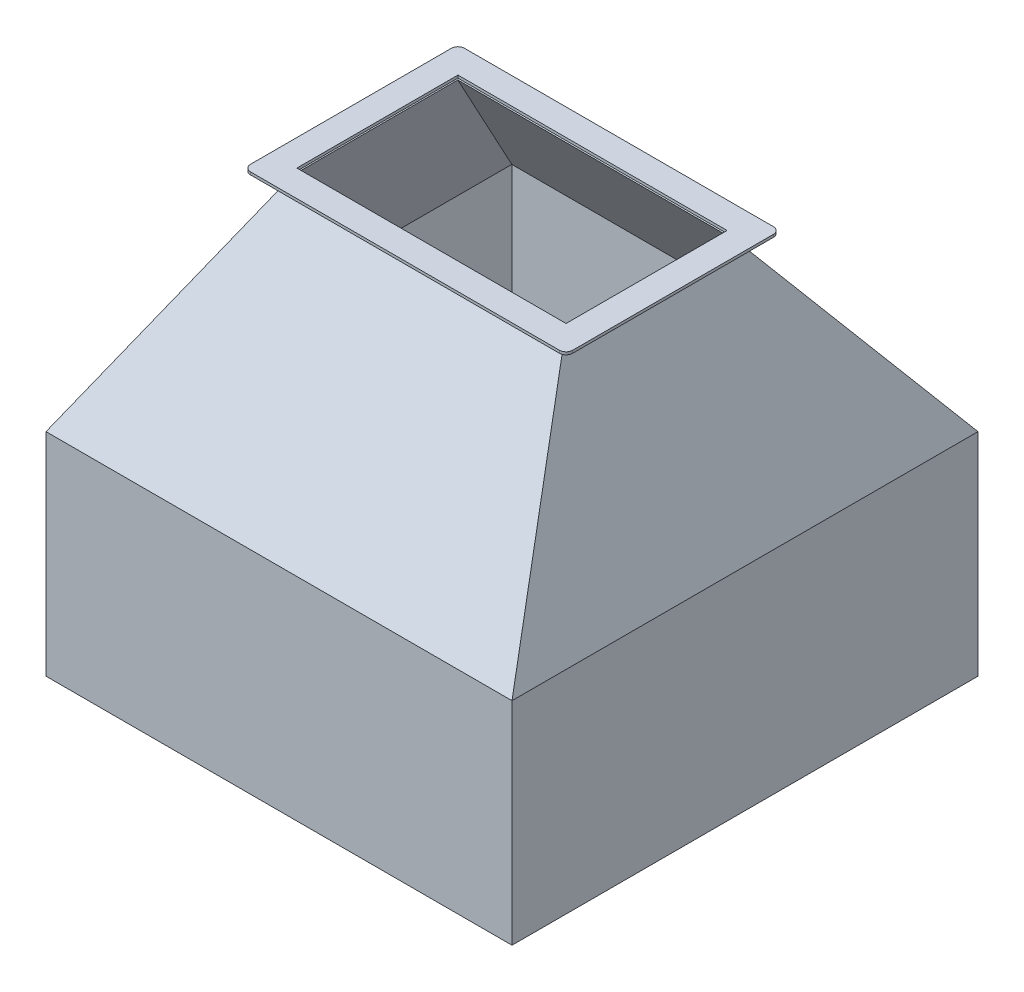
ISO-10303-21;
HEADER;
FILE_DESCRIPTION(('STEP AP214'),'2;1');
FILE_NAME('part.step','',(''),(''),'','','');
FILE_SCHEMA(('AUTOMOTIVE_DESIGN { 1 0 10303 214 1 1 1 1 }'));
ENDSEC;
DATA;
#1=APPLICATION_CONTEXT('core data for automotive mechanical design processes');
#2=APPLICATION_PROTOCOL_DEFINITION('international standard','automotive_design',2000,#1);
#3=PRODUCT_CONTEXT('',#1,'mechanical');
#4=PRODUCT('Part','Part','',(#3));
#5=PRODUCT_RELATED_PRODUCT_CATEGORY('part','',(#4));
#6=PRODUCT_DEFINITION_FORMATION('','',#4);
#7=PRODUCT_DEFINITION_CONTEXT('part definition',#1,'design');
#8=PRODUCT_DEFINITION('design','',#6,#7);
#9=PRODUCT_DEFINITION_SHAPE('','',#8);
#10=(LENGTH_UNIT() NAMED_UNIT(*) SI_UNIT(.MILLI.,.METRE.));
#11=(NAMED_UNIT(*) PLANE_ANGLE_UNIT() SI_UNIT($,.RADIAN.));
#12=(NAMED_UNIT(*) SI_UNIT($,.STERADIAN.) SOLID_ANGLE_UNIT());
#13=UNCERTAINTY_MEASURE_WITH_UNIT(LENGTH_MEASURE(1.E-05),#10,'distance_accuracy_value','');
#14=(GEOMETRIC_REPRESENTATION_CONTEXT(3) GLOBAL_UNCERTAINTY_ASSIGNED_CONTEXT((#13)) GLOBAL_UNIT_ASSIGNED_CONTEXT((#10,
#11,#12)) REPRESENTATION_CONTEXT('',''));
#15=CARTESIAN_POINT('',(0.,0.,0.));
#16=DIRECTION('',(0.,0.,1.));
#17=DIRECTION('',(1.,0.,0.));
#18=AXIS2_PLACEMENT_3D('',#15,#16,#17);
#19=CARTESIAN_POINT('',(0.,-456.,0.));
#20=DIRECTION('',(0.,-1.,0.));
#21=DIRECTION('',(0.,0.,-1.));
#22=AXIS2_PLACEMENT_3D('',#19,#20,#21);
#23=PLANE('',#22);
#24=DIRECTION('',(0.,0.,1.));
#25=VECTOR('',#24,1.);
#26=CARTESIAN_POINT('',(524.651839642762,-456.,0.));
#27=LINE('',#26,#25);
#28=CARTESIAN_POINT('',(524.651839642762,-456.,-524.217759335467));
#29=VERTEX_POINT('',#28);
#30=CARTESIAN_POINT('',(524.651839642762,-456.,524.217759335468));
#31=VERTEX_POINT('',#30);
#32=EDGE_CURVE('E336',#29,#31,#27,.T.);
#33=ORIENTED_EDGE('',*,*,#32,.F.);
#34=DIRECTION('',(1.,0.,0.));
#35=VECTOR('',#34,1.);
#36=CARTESIAN_POINT('',(1.65340518844217E-13,-456.,-524.217759335467));
#37=LINE('',#36,#35);
#38=CARTESIAN_POINT('',(-524.651839642762,-456.,-524.217759335467));
#39=VERTEX_POINT('',#38);
#40=EDGE_CURVE('E338',#39,#29,#37,.T.);
#41=ORIENTED_EDGE('',*,*,#40,.F.);
#42=DIRECTION('',(0.,0.,-1.));
#43=VECTOR('',#42,1.);
#44=CARTESIAN_POINT('',(-524.651839642762,-456.,0.));
#45=LINE('',#44,#43);
#46=CARTESIAN_POINT('',(-524.651839642762,-456.,524.217759335467));
#47=VERTEX_POINT('',#46);
#48=EDGE_CURVE('E340',#47,#39,#45,.T.);
#49=ORIENTED_EDGE('',*,*,#48,.F.);
#50=DIRECTION('',(-1.,0.,0.));
#51=VECTOR('',#50,1.);
#52=CARTESIAN_POINT('',(-1.10227012562812E-13,-456.,524.217759335468));
#53=LINE('',#52,#51);
#54=EDGE_CURVE('E343',#31,#47,#53,.T.);
#55=ORIENTED_EDGE('',*,*,#54,.F.);
#56=EDGE_LOOP('',(#33,#41,#49,#55));
#57=FACE_BOUND('',#56,.T.);
#58=DIRECTION('',(-1.,0.,0.));
#59=VECTOR('',#58,1.);
#60=CARTESIAN_POINT('',(-1.10391493925797E-13,-456.,525.));
#61=LINE('',#60,#59);
#62=CARTESIAN_POINT('',(525.,-456.,525.));
#63=VERTEX_POINT('',#62);
#64=CARTESIAN_POINT('',(-525.,-456.,525.));
#65=VERTEX_POINT('',#64);
#66=EDGE_CURVE('E177',#63,#65,#61,.T.);
#67=ORIENTED_EDGE('',*,*,#66,.T.);
#68=DIRECTION('',(0.,0.,-1.));
#69=VECTOR('',#68,1.);
#70=CARTESIAN_POINT('',(-525.,-456.,0.));
#71=LINE('',#70,#69);
#72=CARTESIAN_POINT('',(-525.,-456.,-525.));
#73=VERTEX_POINT('',#72);
#74=EDGE_CURVE('E190',#65,#73,#71,.T.);
#75=ORIENTED_EDGE('',*,*,#74,.T.);
#76=DIRECTION('',(1.,0.,0.));
#77=VECTOR('',#76,1.);
#78=CARTESIAN_POINT('',(1.65587240888695E-13,-456.,-525.));
#79=LINE('',#78,#77);
#80=CARTESIAN_POINT('',(525.,-456.,-525.));
#81=VERTEX_POINT('',#80);
#82=EDGE_CURVE('E178',#73,#81,#79,.T.);
#83=ORIENTED_EDGE('',*,*,#82,.T.);
#84=DIRECTION('',(0.,0.,1.));
#85=VECTOR('',#84,1.);
#86=CARTESIAN_POINT('',(525.,-456.,0.));
#87=LINE('',#86,#85);
#88=EDGE_CURVE('E167',#81,#63,#87,.T.);
#89=ORIENTED_EDGE('',*,*,#88,.T.);
#90=EDGE_LOOP('',(#67,#75,#83,#89));
#91=FACE_BOUND('',#90,.T.);
#92=ADVANCED_FACE('F65',(#57,#91),#23,.T.);
#93=CARTESIAN_POINT('',(0.,-6.00000000000001,0.));
#94=DIRECTION('',(0.,1.,0.));
#95=DIRECTION('',(0.,0.,1.));
#96=AXIS2_PLACEMENT_3D('',#93,#94,#95);
#97=PLANE('',#96);
#98=DIRECTION('',(0.,0.,1.));
#99=VECTOR('',#98,1.);
#100=CARTESIAN_POINT('',(305.,-6.00000000000001,-182.5));
#101=LINE('',#100,#99);
#102=CARTESIAN_POINT('',(305.,-6.00000000000001,-182.5));
#103=VERTEX_POINT('',#102);
#104=CARTESIAN_POINT('',(305.,-6.00000000000001,182.5));
#105=VERTEX_POINT('',#104);
#106=EDGE_CURVE('E345',#103,#105,#101,.T.);
#107=ORIENTED_EDGE('',*,*,#106,.F.);
#108=DIRECTION('',(1.,0.,0.));
#109=VECTOR('',#108,1.);
#110=CARTESIAN_POINT('',(-305.,-6.00000000000001,-182.5));
#111=LINE('',#110,#109);
#112=CARTESIAN_POINT('',(-305.,-6.00000000000001,-182.5));
#113=VERTEX_POINT('',#112);
#114=EDGE_CURVE('E362',#113,#103,#111,.T.);
#115=ORIENTED_EDGE('',*,*,#114,.F.);
#116=DIRECTION('',(0.,0.,-1.));
#117=VECTOR('',#116,1.);
#118=CARTESIAN_POINT('',(-305.,-6.00000000000001,-182.5));
#119=LINE('',#118,#117);
#120=CARTESIAN_POINT('',(-305.,-6.00000000000001,182.5));
#121=VERTEX_POINT('',#120);
#122=EDGE_CURVE('E409',#121,#113,#119,.T.);
#123=ORIENTED_EDGE('',*,*,#122,.F.);
#124=DIRECTION('',(-1.,0.,0.));
#125=VECTOR('',#124,1.);
#126=CARTESIAN_POINT('',(-305.,-6.00000000000001,182.5));
#127=LINE('',#126,#125);
#128=EDGE_CURVE('E427',#105,#121,#127,.T.);
#129=ORIENTED_EDGE('',*,*,#128,.F.);
#130=EDGE_LOOP('',(#107,#115,#123,#129));
#131=FACE_BOUND('',#130,.T.);
#132=DIRECTION('',(1.,0.,0.));
#133=VECTOR('',#132,1.);
#134=CARTESIAN_POINT('',(0.,-6.00000000000001,-178.717759335467));
#135=LINE('',#134,#133);
#136=CARTESIAN_POINT('',(-301.651839642762,-6.00000000000001,-178.717759335467));
#137=VERTEX_POINT('',#136);
#138=CARTESIAN_POINT('',(301.651839642762,-6.00000000000001,-178.717759335467));
#139=VERTEX_POINT('',#138);
#140=EDGE_CURVE('E330',#137,#139,#135,.T.);
#141=ORIENTED_EDGE('',*,*,#140,.T.);
#142=DIRECTION('',(0.,0.,1.));
#143=VECTOR('',#142,1.);
#144=CARTESIAN_POINT('',(301.651839642762,-6.00000000000001,0.));
#145=LINE('',#144,#143);
#146=CARTESIAN_POINT('',(301.651839642762,-6.00000000000001,178.717759335467));
#147=VERTEX_POINT('',#146);
#148=EDGE_CURVE('E355',#139,#147,#145,.T.);
#149=ORIENTED_EDGE('',*,*,#148,.T.);
#150=DIRECTION('',(-1.,0.,0.));
#151=VECTOR('',#150,1.);
#152=CARTESIAN_POINT('',(0.,-6.00000000000001,178.717759335467));
#153=LINE('',#152,#151);
#154=CARTESIAN_POINT('',(-301.651839642762,-6.00000000000001,178.717759335467));
#155=VERTEX_POINT('',#154);
#156=EDGE_CURVE('E352',#147,#155,#153,.T.);
#157=ORIENTED_EDGE('',*,*,#156,.T.);
#158=DIRECTION('',(0.,0.,-1.));
#159=VECTOR('',#158,1.);
#160=CARTESIAN_POINT('',(-301.651839642762,-6.00000000000001,0.));
#161=LINE('',#160,#159);
#162=EDGE_CURVE('E349',#155,#137,#161,.T.);
#163=ORIENTED_EDGE('',*,*,#162,.T.);
#164=EDGE_LOOP('',(#141,#149,#157,#163));
#165=FACE_BOUND('',#164,.T.);
#166=ADVANCED_FACE('F381',(#131,#165),#97,.T.);
#167=CARTESIAN_POINT('',(0.,85.9289294366286,-111.919010843655));
#168=DIRECTION('',(0.,-0.608986454757484,0.793180621247085));
#169=DIRECTION('',(0.,-0.793180621247085,-0.608986454757484));
#170=AXIS2_PLACEMENT_3D('',#167,#168,#169);
#171=PLANE('',#170);
#172=DIRECTION('',(0.365820002737873,-0.738201799246828,-0.566774936977287));
#173=VECTOR('',#172,1.);
#174=CARTESIAN_POINT('',(305.,-6.00000000000001,-182.5));
#175=LINE('',#174,#173);
#176=CARTESIAN_POINT('',(528.,-456.,-528.));
#177=VERTEX_POINT('',#176);
#178=EDGE_CURVE('E408',#103,#177,#175,.T.);
#179=ORIENTED_EDGE('',*,*,#178,.T.);
#180=DIRECTION('',(1.,0.,0.));
#181=VECTOR('',#180,1.);
#182=CARTESIAN_POINT('',(-528.,-456.,-528.));
#183=LINE('',#182,#181);
#184=CARTESIAN_POINT('',(-528.,-456.,-528.));
#185=VERTEX_POINT('',#184);
#186=EDGE_CURVE('E437',#185,#177,#183,.T.);
#187=ORIENTED_EDGE('',*,*,#186,.F.);
#188=DIRECTION('',(-0.365820002737873,-0.738201799246828,-0.566774936977287));
#189=VECTOR('',#188,1.);
#190=CARTESIAN_POINT('',(-305.,-6.00000000000001,-182.5));
#191=LINE('',#190,#189);
#192=EDGE_CURVE('E368',#113,#185,#191,.T.);
#193=ORIENTED_EDGE('',*,*,#192,.F.);
#194=ORIENTED_EDGE('',*,*,#114,.T.);
#195=EDGE_LOOP('',(#179,#187,#193,#194));
#196=FACE_BOUND('',#195,.T.);
#197=ADVANCED_FACE('F370',(#196),#171,.F.);
#198=CARTESIAN_POINT('',(-242.479651427869,120.162138374255,0.));
#199=DIRECTION('',(-0.896014431780413,0.444024929526738,0.));
#200=DIRECTION('',(-0.444024929526738,-0.896014431780413,0.));
#201=AXIS2_PLACEMENT_3D('',#198,#199,#200);
#202=PLANE('',#201);
#203=ORIENTED_EDGE('',*,*,#192,.T.);
#204=DIRECTION('',(0.,0.,-1.));
#205=VECTOR('',#204,1.);
#206=CARTESIAN_POINT('',(-528.,-456.,528.));
#207=LINE('',#206,#205);
#208=CARTESIAN_POINT('',(-528.,-456.,528.));
#209=VERTEX_POINT('',#208);
#210=EDGE_CURVE('E73',#209,#185,#207,.T.);
#211=ORIENTED_EDGE('',*,*,#210,.F.);
#212=DIRECTION('',(-0.365820002737873,-0.738201799246828,0.566774936977287));
#213=VECTOR('',#212,1.);
#214=CARTESIAN_POINT('',(-305.,-6.00000000000001,182.5));
#215=LINE('',#214,#213);
#216=EDGE_CURVE('E454',#121,#209,#215,.T.);
#217=ORIENTED_EDGE('',*,*,#216,.F.);
#218=ORIENTED_EDGE('',*,*,#122,.T.);
#219=EDGE_LOOP('',(#203,#211,#217,#218));
#220=FACE_BOUND('',#219,.T.);
#221=ADVANCED_FACE('F380',(#220),#202,.T.);
#222=CARTESIAN_POINT('',(242.479651427869,120.162138374255,0.));
#223=DIRECTION('',(0.896014431780413,0.444024929526738,0.));
#224=DIRECTION('',(-0.444024929526738,0.896014431780413,0.));
#225=AXIS2_PLACEMENT_3D('',#222,#223,#224);
#226=PLANE('',#225);
#227=DIRECTION('',(0.365820002737873,-0.738201799246828,0.566774936977287));
#228=VECTOR('',#227,1.);
#229=CARTESIAN_POINT('',(305.,-6.00000000000001,182.5));
#230=LINE('',#229,#228);
#231=CARTESIAN_POINT('',(528.,-456.,528.));
#232=VERTEX_POINT('',#231);
#233=EDGE_CURVE('E459',#105,#232,#230,.T.);
#234=ORIENTED_EDGE('',*,*,#233,.T.);
#235=DIRECTION('',(0.,0.,1.));
#236=VECTOR('',#235,1.);
#237=CARTESIAN_POINT('',(528.,-456.,528.));
#238=LINE('',#237,#236);
#239=EDGE_CURVE('E445',#177,#232,#238,.T.);
#240=ORIENTED_EDGE('',*,*,#239,.F.);
#241=ORIENTED_EDGE('',*,*,#178,.F.);
#242=ORIENTED_EDGE('',*,*,#106,.T.);
#243=EDGE_LOOP('',(#234,#240,#241,#242));
#244=FACE_BOUND('',#243,.T.);
#245=ADVANCED_FACE('F387',(#244),#226,.T.);
#246=CARTESIAN_POINT('',(0.,85.9289294366286,111.919010843655));
#247=DIRECTION('',(0.,-0.608986454757484,-0.793180621247085));
#248=DIRECTION('',(0.,0.793180621247085,-0.608986454757484));
#249=AXIS2_PLACEMENT_3D('',#246,#247,#248);
#250=PLANE('',#249);
#251=ORIENTED_EDGE('',*,*,#216,.T.);
#252=DIRECTION('',(-1.,0.,0.));
#253=VECTOR('',#252,1.);
#254=CARTESIAN_POINT('',(-528.,-456.,528.));
#255=LINE('',#254,#253);
#256=EDGE_CURVE('E13',#232,#209,#255,.T.);
#257=ORIENTED_EDGE('',*,*,#256,.F.);
#258=ORIENTED_EDGE('',*,*,#233,.F.);
#259=ORIENTED_EDGE('',*,*,#128,.T.);
#260=EDGE_LOOP('',(#251,#257,#258,#259));
#261=FACE_BOUND('',#260,.T.);
#262=ADVANCED_FACE('F471',(#261),#250,.F.);
#263=CARTESIAN_POINT('',(0.,84.1019700723562,-109.539468979914));
#264=DIRECTION('',(0.,-0.608986454757484,0.793180621247085));
#265=DIRECTION('',(0.,-0.793180621247085,-0.608986454757484));
#266=AXIS2_PLACEMENT_3D('',#263,#264,#265);
#267=PLANE('',#266);
#268=DIRECTION('',(0.365820002737873,-0.738201799246828,-0.566774936977287));
#269=VECTOR('',#268,1.);
#270=CARTESIAN_POINT('',(222.608294268989,153.504912189228,-56.2534323101822));
#271=LINE('',#270,#269);
#272=EDGE_CURVE('E322',#139,#29,#271,.T.);
#273=ORIENTED_EDGE('',*,*,#272,.F.);
#274=ORIENTED_EDGE('',*,*,#140,.F.);
#275=DIRECTION('',(-0.365820002737873,-0.738201799246828,-0.566774936977287));
#276=VECTOR('',#275,1.);
#277=CARTESIAN_POINT('',(-222.608294268989,153.504912189228,-56.2534323101823));
#278=LINE('',#277,#276);
#279=EDGE_CURVE('E89',#137,#39,#278,.T.);
#280=ORIENTED_EDGE('',*,*,#279,.T.);
#281=ORIENTED_EDGE('',*,*,#40,.T.);
#282=EDGE_LOOP('',(#273,#274,#280,#281));
#283=FACE_BOUND('',#282,.T.);
#284=ADVANCED_FACE('F479',(#283),#267,.T.);
#285=CARTESIAN_POINT('',(-239.791608132528,118.830063585675,0.));
#286=DIRECTION('',(-0.896014431780413,0.444024929526738,0.));
#287=DIRECTION('',(-0.444024929526738,-0.896014431780413,0.));
#288=AXIS2_PLACEMENT_3D('',#285,#286,#287);
#289=PLANE('',#288);
#290=ORIENTED_EDGE('',*,*,#279,.F.);
#291=ORIENTED_EDGE('',*,*,#162,.F.);
#292=DIRECTION('',(-0.365820002737873,-0.738201799246828,0.566774936977287));
#293=VECTOR('',#292,1.);
#294=CARTESIAN_POINT('',(-222.608294268989,153.504912189228,56.2534323101822));
#295=LINE('',#294,#293);
#296=EDGE_CURVE('E333',#155,#47,#295,.T.);
#297=ORIENTED_EDGE('',*,*,#296,.T.);
#298=ORIENTED_EDGE('',*,*,#48,.T.);
#299=EDGE_LOOP('',(#290,#291,#297,#298));
#300=FACE_BOUND('',#299,.T.);
#301=ADVANCED_FACE('F484',(#300),#289,.F.);
#302=CARTESIAN_POINT('',(239.791608132528,118.830063585675,0.));
#303=DIRECTION('',(0.896014431780413,0.444024929526738,0.));
#304=DIRECTION('',(-0.444024929526738,0.896014431780413,0.));
#305=AXIS2_PLACEMENT_3D('',#302,#303,#304);
#306=PLANE('',#305);
#307=DIRECTION('',(0.365820002737873,-0.738201799246828,0.566774936977287));
#308=VECTOR('',#307,1.);
#309=CARTESIAN_POINT('',(222.608294268989,153.504912189228,56.2534323101823));
#310=LINE('',#309,#308);
#311=EDGE_CURVE('E332',#147,#31,#310,.T.);
#312=ORIENTED_EDGE('',*,*,#311,.F.);
#313=ORIENTED_EDGE('',*,*,#148,.F.);
#314=ORIENTED_EDGE('',*,*,#272,.T.);
#315=ORIENTED_EDGE('',*,*,#32,.T.);
#316=EDGE_LOOP('',(#312,#313,#314,#315));
#317=FACE_BOUND('',#316,.T.);
#318=ADVANCED_FACE('F497',(#317),#306,.F.);
#319=CARTESIAN_POINT('',(0.,84.1019700723562,109.539468979914));
#320=DIRECTION('',(0.,-0.608986454757484,-0.793180621247085));
#321=DIRECTION('',(0.,0.793180621247085,-0.608986454757484));
#322=AXIS2_PLACEMENT_3D('',#319,#320,#321);
#323=PLANE('',#322);
#324=ORIENTED_EDGE('',*,*,#296,.F.);
#325=ORIENTED_EDGE('',*,*,#156,.F.);
#326=ORIENTED_EDGE('',*,*,#311,.T.);
#327=ORIENTED_EDGE('',*,*,#54,.T.);
#328=EDGE_LOOP('',(#324,#325,#326,#327));
#329=FACE_BOUND('',#328,.T.);
#330=ADVANCED_FACE('F296',(#329),#323,.T.);
#331=CARTESIAN_POINT('',(0.,-936.,0.));
#332=DIRECTION('',(0.,-1.,0.));
#333=DIRECTION('',(0.,0.,-1.));
#334=AXIS2_PLACEMENT_3D('',#331,#332,#333);
#335=PLANE('',#334);
#336=DIRECTION('',(1.,0.,0.));
#337=VECTOR('',#336,1.);
#338=CARTESIAN_POINT('',(1.65587240888695E-13,-936.,-525.));
#339=LINE('',#338,#337);
#340=CARTESIAN_POINT('',(-525.,-936.,-525.));
#341=VERTEX_POINT('',#340);
#342=CARTESIAN_POINT('',(525.,-936.,-525.));
#343=VERTEX_POINT('',#342);
#344=EDGE_CURVE('E186',#341,#343,#339,.T.);
#345=ORIENTED_EDGE('',*,*,#344,.F.);
#346=DIRECTION('',(0.,0.,-1.));
#347=VECTOR('',#346,1.);
#348=CARTESIAN_POINT('',(-525.,-936.,0.));
#349=LINE('',#348,#347);
#350=CARTESIAN_POINT('',(-525.,-936.,525.));
#351=VERTEX_POINT('',#350);
#352=EDGE_CURVE('E199',#351,#341,#349,.T.);
#353=ORIENTED_EDGE('',*,*,#352,.F.);
#354=DIRECTION('',(-1.,0.,0.));
#355=VECTOR('',#354,1.);
#356=CARTESIAN_POINT('',(-1.10391493925797E-13,-936.,525.));
#357=LINE('',#356,#355);
#358=CARTESIAN_POINT('',(525.,-936.,525.));
#359=VERTEX_POINT('',#358);
#360=EDGE_CURVE('E197',#359,#351,#357,.T.);
#361=ORIENTED_EDGE('',*,*,#360,.F.);
#362=DIRECTION('',(0.,0.,1.));
#363=VECTOR('',#362,1.);
#364=CARTESIAN_POINT('',(525.,-936.,0.));
#365=LINE('',#364,#363);
#366=EDGE_CURVE('E200',#343,#359,#365,.T.);
#367=ORIENTED_EDGE('',*,*,#366,.F.);
#368=EDGE_LOOP('',(#345,#353,#361,#367));
#369=FACE_BOUND('',#368,.T.);
#370=DIRECTION('',(1.,0.,0.));
#371=VECTOR('',#370,1.);
#372=CARTESIAN_POINT('',(-528.,-936.,-528.));
#373=LINE('',#372,#371);
#374=CARTESIAN_POINT('',(-528.,-936.,-528.));
#375=VERTEX_POINT('',#374);
#376=CARTESIAN_POINT('',(528.,-936.,-528.));
#377=VERTEX_POINT('',#376);
#378=EDGE_CURVE('E196',#375,#377,#373,.T.);
#379=ORIENTED_EDGE('',*,*,#378,.T.);
#380=DIRECTION('',(0.,0.,1.));
#381=VECTOR('',#380,1.);
#382=CARTESIAN_POINT('',(528.,-936.,-528.));
#383=LINE('',#382,#381);
#384=CARTESIAN_POINT('',(528.,-936.,528.));
#385=VERTEX_POINT('',#384);
#386=EDGE_CURVE('E311',#377,#385,#383,.T.);
#387=ORIENTED_EDGE('',*,*,#386,.T.);
#388=DIRECTION('',(-1.,0.,0.));
#389=VECTOR('',#388,1.);
#390=CARTESIAN_POINT('',(528.,-936.,528.));
#391=LINE('',#390,#389);
#392=CARTESIAN_POINT('',(-528.,-936.,528.));
#393=VERTEX_POINT('',#392);
#394=EDGE_CURVE('E277',#385,#393,#391,.T.);
#395=ORIENTED_EDGE('',*,*,#394,.T.);
#396=DIRECTION('',(0.,0.,-1.));
#397=VECTOR('',#396,1.);
#398=CARTESIAN_POINT('',(-528.,-936.,528.));
#399=LINE('',#398,#397);
#400=EDGE_CURVE('E209',#393,#375,#399,.T.);
#401=ORIENTED_EDGE('',*,*,#400,.T.);
#402=EDGE_LOOP('',(#379,#387,#395,#401));
#403=FACE_BOUND('',#402,.T.);
#404=ADVANCED_FACE('F287',(#369,#403),#335,.T.);
#405=CARTESIAN_POINT('',(-1.11022302462516E-13,0.,528.));
#406=DIRECTION('',(0.,0.,1.));
#407=DIRECTION('',(1.,0.,0.));
#408=AXIS2_PLACEMENT_3D('',#405,#406,#407);
#409=PLANE('',#408);
#410=DIRECTION('',(0.,1.,0.));
#411=VECTOR('',#410,1.);
#412=CARTESIAN_POINT('',(528.,-936.,528.));
#413=LINE('',#412,#411);
#414=EDGE_CURVE('E276',#385,#232,#413,.T.);
#415=ORIENTED_EDGE('',*,*,#414,.T.);
#416=ORIENTED_EDGE('',*,*,#256,.T.);
#417=DIRECTION('',(0.,1.,0.));
#418=VECTOR('',#417,1.);
#419=CARTESIAN_POINT('',(-528.,-936.,528.));
#420=LINE('',#419,#418);
#421=EDGE_CURVE('E215',#393,#209,#420,.T.);
#422=ORIENTED_EDGE('',*,*,#421,.F.);
#423=ORIENTED_EDGE('',*,*,#394,.F.);
#424=EDGE_LOOP('',(#415,#416,#422,#423));
#425=FACE_BOUND('',#424,.T.);
#426=ADVANCED_FACE('F228',(#425),#409,.T.);
#427=CARTESIAN_POINT('',(-528.,0.,0.));
#428=DIRECTION('',(-1.,0.,0.));
#429=DIRECTION('',(0.,0.,1.));
#430=AXIS2_PLACEMENT_3D('',#427,#428,#429);
#431=PLANE('',#430);
#432=ORIENTED_EDGE('',*,*,#421,.T.);
#433=ORIENTED_EDGE('',*,*,#210,.T.);
#434=DIRECTION('',(0.,1.,0.));
#435=VECTOR('',#434,1.);
#436=CARTESIAN_POINT('',(-528.,-936.,-528.));
#437=LINE('',#436,#435);
#438=EDGE_CURVE('E252',#375,#185,#437,.T.);
#439=ORIENTED_EDGE('',*,*,#438,.F.);
#440=ORIENTED_EDGE('',*,*,#400,.F.);
#441=EDGE_LOOP('',(#432,#433,#439,#440));
#442=FACE_BOUND('',#441,.T.);
#443=ADVANCED_FACE('F217',(#442),#431,.T.);
#444=CARTESIAN_POINT('',(528.,0.,0.));
#445=DIRECTION('',(1.,0.,0.));
#446=DIRECTION('',(0.,0.,-1.));
#447=AXIS2_PLACEMENT_3D('',#444,#445,#446);
#448=PLANE('',#447);
#449=DIRECTION('',(0.,1.,0.));
#450=VECTOR('',#449,1.);
#451=CARTESIAN_POINT('',(528.,-936.,-528.));
#452=LINE('',#451,#450);
#453=EDGE_CURVE('E244',#377,#177,#452,.T.);
#454=ORIENTED_EDGE('',*,*,#453,.T.);
#455=ORIENTED_EDGE('',*,*,#239,.T.);
#456=ORIENTED_EDGE('',*,*,#414,.F.);
#457=ORIENTED_EDGE('',*,*,#386,.F.);
#458=EDGE_LOOP('',(#454,#455,#456,#457));
#459=FACE_BOUND('',#458,.T.);
#460=ADVANCED_FACE('F227',(#459),#448,.T.);
#461=CARTESIAN_POINT('',(1.66533453693773E-13,0.,-528.));
#462=DIRECTION('',(0.,0.,-1.));
#463=DIRECTION('',(-1.,0.,0.));
#464=AXIS2_PLACEMENT_3D('',#461,#462,#463);
#465=PLANE('',#464);
#466=ORIENTED_EDGE('',*,*,#438,.T.);
#467=ORIENTED_EDGE('',*,*,#186,.T.);
#468=ORIENTED_EDGE('',*,*,#453,.F.);
#469=ORIENTED_EDGE('',*,*,#378,.F.);
#470=EDGE_LOOP('',(#466,#467,#468,#469));
#471=FACE_BOUND('',#470,.T.);
#472=ADVANCED_FACE('F234',(#471),#465,.T.);
#473=CARTESIAN_POINT('',(-1.10391493925797E-13,0.,525.));
#474=DIRECTION('',(0.,0.,1.));
#475=DIRECTION('',(1.,0.,0.));
#476=AXIS2_PLACEMENT_3D('',#473,#474,#475);
#477=PLANE('',#476);
#478=DIRECTION('',(0.,1.,0.));
#479=VECTOR('',#478,1.);
#480=CARTESIAN_POINT('',(525.,0.,525.));
#481=LINE('',#480,#479);
#482=EDGE_CURVE('E173',#359,#63,#481,.T.);
#483=ORIENTED_EDGE('',*,*,#482,.F.);
#484=ORIENTED_EDGE('',*,*,#360,.T.);
#485=DIRECTION('',(0.,1.,0.));
#486=VECTOR('',#485,1.);
#487=CARTESIAN_POINT('',(-525.,0.,525.));
#488=LINE('',#487,#486);
#489=EDGE_CURVE('E81',#351,#65,#488,.T.);
#490=ORIENTED_EDGE('',*,*,#489,.T.);
#491=ORIENTED_EDGE('',*,*,#66,.F.);
#492=EDGE_LOOP('',(#483,#484,#490,#491));
#493=FACE_BOUND('',#492,.T.);
#494=ADVANCED_FACE('F558',(#493),#477,.F.);
#495=CARTESIAN_POINT('',(-525.,0.,0.));
#496=DIRECTION('',(-1.,0.,0.));
#497=DIRECTION('',(0.,0.,1.));
#498=AXIS2_PLACEMENT_3D('',#495,#496,#497);
#499=PLANE('',#498);
#500=ORIENTED_EDGE('',*,*,#489,.F.);
#501=ORIENTED_EDGE('',*,*,#352,.T.);
#502=DIRECTION('',(0.,1.,0.));
#503=VECTOR('',#502,1.);
#504=CARTESIAN_POINT('',(-525.,0.,-525.));
#505=LINE('',#504,#503);
#506=EDGE_CURVE('E188',#341,#73,#505,.T.);
#507=ORIENTED_EDGE('',*,*,#506,.T.);
#508=ORIENTED_EDGE('',*,*,#74,.F.);
#509=EDGE_LOOP('',(#500,#501,#507,#508));
#510=FACE_BOUND('',#509,.T.);
#511=ADVANCED_FACE('F566',(#510),#499,.F.);
#512=CARTESIAN_POINT('',(525.,0.,0.));
#513=DIRECTION('',(1.,0.,0.));
#514=DIRECTION('',(0.,0.,-1.));
#515=AXIS2_PLACEMENT_3D('',#512,#513,#514);
#516=PLANE('',#515);
#517=DIRECTION('',(0.,1.,0.));
#518=VECTOR('',#517,1.);
#519=CARTESIAN_POINT('',(525.,0.,-525.));
#520=LINE('',#519,#518);
#521=EDGE_CURVE('E171',#343,#81,#520,.T.);
#522=ORIENTED_EDGE('',*,*,#521,.F.);
#523=ORIENTED_EDGE('',*,*,#366,.T.);
#524=ORIENTED_EDGE('',*,*,#482,.T.);
#525=ORIENTED_EDGE('',*,*,#88,.F.);
#526=EDGE_LOOP('',(#522,#523,#524,#525));
#527=FACE_BOUND('',#526,.T.);
#528=ADVANCED_FACE('F169',(#527),#516,.F.);
#529=CARTESIAN_POINT('',(1.65587240888695E-13,0.,-525.));
#530=DIRECTION('',(0.,0.,-1.));
#531=DIRECTION('',(-1.,0.,0.));
#532=AXIS2_PLACEMENT_3D('',#529,#530,#531);
#533=PLANE('',#532);
#534=ORIENTED_EDGE('',*,*,#506,.F.);
#535=ORIENTED_EDGE('',*,*,#344,.T.);
#536=ORIENTED_EDGE('',*,*,#521,.T.);
#537=ORIENTED_EDGE('',*,*,#82,.F.);
#538=EDGE_LOOP('',(#534,#535,#536,#537));
#539=FACE_BOUND('',#538,.T.);
#540=ADVANCED_FACE('F183',(#539),#533,.F.);
#541=CLOSED_SHELL('',(#92,#166,#197,#221,#245,#262,#284,#301,#318,#330,#404,#426,#443,#460,#472,
#494,#511,#528,#540));
#542=MANIFOLD_SOLID_BREP('B2',#541);
#543=CARTESIAN_POINT('',(350.,-6.,-227.5));
#544=DIRECTION('',(0.,1.,0.));
#545=DIRECTION('',(0.,0.,1.));
#546=AXIS2_PLACEMENT_3D('',#543,#544,#545);
#547=CYLINDRICAL_SURFACE('',#546,15.);
#548=CARTESIAN_POINT('',(350.,0.,-227.5));
#549=DIRECTION('',(0.,1.,0.));
#550=DIRECTION('',(0.,0.,-1.));
#551=AXIS2_PLACEMENT_3D('',#548,#549,#550);
#552=CIRCLE('',#551,15.);
#553=CARTESIAN_POINT('',(365.,0.,-227.5));
#554=VERTEX_POINT('',#553);
#555=CARTESIAN_POINT('',(350.,0.,-242.5));
#556=VERTEX_POINT('',#555);
#557=EDGE_CURVE('E812',#554,#556,#552,.T.);
#558=ORIENTED_EDGE('',*,*,#557,.F.);
#559=DIRECTION('',(0.,1.,0.));
#560=VECTOR('',#559,1.);
#561=CARTESIAN_POINT('',(365.,-6.,-227.5));
#562=LINE('',#561,#560);
#563=CARTESIAN_POINT('',(365.,-6.,-227.5));
#564=VERTEX_POINT('',#563);
#565=EDGE_CURVE('E63',#564,#554,#562,.T.);
#566=ORIENTED_EDGE('',*,*,#565,.F.);
#567=CARTESIAN_POINT('',(350.,-6.,-227.5));
#568=DIRECTION('',(0.,1.,0.));
#569=DIRECTION('',(0.,0.,-1.));
#570=AXIS2_PLACEMENT_3D('',#567,#568,#569);
#571=CIRCLE('',#570,15.);
#572=CARTESIAN_POINT('',(350.,-6.,-242.5));
#573=VERTEX_POINT('',#572);
#574=EDGE_CURVE('E816',#564,#573,#571,.T.);
#575=ORIENTED_EDGE('',*,*,#574,.T.);
#576=DIRECTION('',(0.,1.,0.));
#577=VECTOR('',#576,1.);
#578=CARTESIAN_POINT('',(350.,-6.,-242.5));
#579=LINE('',#578,#577);
#580=EDGE_CURVE('E693',#573,#556,#579,.T.);
#581=ORIENTED_EDGE('',*,*,#580,.T.);
#582=EDGE_LOOP('',(#558,#566,#575,#581));
#583=FACE_BOUND('',#582,.T.);
#584=ADVANCED_FACE('F690',(#583),#547,.T.);
#585=CARTESIAN_POINT('',(365.,-6.,227.5));
#586=DIRECTION('',(1.,0.,0.));
#587=DIRECTION('',(0.,0.,-1.));
#588=AXIS2_PLACEMENT_3D('',#585,#586,#587);
#589=PLANE('',#588);
#590=DIRECTION('',(0.,0.,-1.));
#591=VECTOR('',#590,1.);
#592=CARTESIAN_POINT('',(365.,0.,227.5));
#593=LINE('',#592,#591);
#594=CARTESIAN_POINT('',(365.,0.,227.5));
#595=VERTEX_POINT('',#594);
#596=EDGE_CURVE('E820',#595,#554,#593,.T.);
#597=ORIENTED_EDGE('',*,*,#596,.F.);
#598=DIRECTION('',(0.,1.,0.));
#599=VECTOR('',#598,1.);
#600=CARTESIAN_POINT('',(365.,-6.,227.5));
#601=LINE('',#600,#599);
#602=CARTESIAN_POINT('',(365.,-6.,227.5));
#603=VERTEX_POINT('',#602);
#604=EDGE_CURVE('E698',#603,#595,#601,.T.);
#605=ORIENTED_EDGE('',*,*,#604,.F.);
#606=DIRECTION('',(0.,0.,-1.));
#607=VECTOR('',#606,1.);
#608=CARTESIAN_POINT('',(365.,-6.,227.5));
#609=LINE('',#608,#607);
#610=EDGE_CURVE('E838',#603,#564,#609,.T.);
#611=ORIENTED_EDGE('',*,*,#610,.T.);
#612=ORIENTED_EDGE('',*,*,#565,.T.);
#613=EDGE_LOOP('',(#597,#605,#611,#612));
#614=FACE_BOUND('',#613,.T.);
#615=ADVANCED_FACE('F885',(#614),#589,.T.);
#616=CARTESIAN_POINT('',(350.,-6.,227.5));
#617=DIRECTION('',(0.,1.,0.));
#618=DIRECTION('',(0.,0.,1.));
#619=AXIS2_PLACEMENT_3D('',#616,#617,#618);
#620=CYLINDRICAL_SURFACE('',#619,15.);
#621=CARTESIAN_POINT('',(350.,0.,227.5));
#622=DIRECTION('',(0.,1.,0.));
#623=DIRECTION('',(0.,0.,1.));
#624=AXIS2_PLACEMENT_3D('',#621,#622,#623);
#625=CIRCLE('',#624,15.);
#626=CARTESIAN_POINT('',(350.,0.,242.5));
#627=VERTEX_POINT('',#626);
#628=EDGE_CURVE('E858',#627,#595,#625,.T.);
#629=ORIENTED_EDGE('',*,*,#628,.F.);
#630=DIRECTION('',(0.,1.,0.));
#631=VECTOR('',#630,1.);
#632=CARTESIAN_POINT('',(350.,-6.,242.5));
#633=LINE('',#632,#631);
#634=CARTESIAN_POINT('',(350.,-6.,242.5));
#635=VERTEX_POINT('',#634);
#636=EDGE_CURVE('E864',#635,#627,#633,.T.);
#637=ORIENTED_EDGE('',*,*,#636,.F.);
#638=CARTESIAN_POINT('',(350.,-6.,227.5));
#639=DIRECTION('',(0.,1.,0.));
#640=DIRECTION('',(0.,0.,1.));
#641=AXIS2_PLACEMENT_3D('',#638,#639,#640);
#642=CIRCLE('',#641,15.);
#643=EDGE_CURVE('E835',#635,#603,#642,.T.);
#644=ORIENTED_EDGE('',*,*,#643,.T.);
#645=ORIENTED_EDGE('',*,*,#604,.T.);
#646=EDGE_LOOP('',(#629,#637,#644,#645));
#647=FACE_BOUND('',#646,.T.);
#648=ADVANCED_FACE('F904',(#647),#620,.T.);
#649=CARTESIAN_POINT('',(-350.,-6.,242.5));
#650=DIRECTION('',(0.,0.,1.));
#651=DIRECTION('',(1.,0.,0.));
#652=AXIS2_PLACEMENT_3D('',#649,#650,#651);
#653=PLANE('',#652);
#654=DIRECTION('',(1.,0.,0.));
#655=VECTOR('',#654,1.);
#656=CARTESIAN_POINT('',(-350.,0.,242.5));
#657=LINE('',#656,#655);
#658=CARTESIAN_POINT('',(-350.,0.,242.5));
#659=VERTEX_POINT('',#658);
#660=EDGE_CURVE('E855',#659,#627,#657,.T.);
#661=ORIENTED_EDGE('',*,*,#660,.F.);
#662=DIRECTION('',(0.,1.,0.));
#663=VECTOR('',#662,1.);
#664=CARTESIAN_POINT('',(-350.,-6.,242.5));
#665=LINE('',#664,#663);
#666=CARTESIAN_POINT('',(-350.,-6.,242.5));
#667=VERTEX_POINT('',#666);
#668=EDGE_CURVE('E866',#667,#659,#665,.T.);
#669=ORIENTED_EDGE('',*,*,#668,.F.);
#670=DIRECTION('',(1.,0.,0.));
#671=VECTOR('',#670,1.);
#672=CARTESIAN_POINT('',(-350.,-6.,242.5));
#673=LINE('',#672,#671);
#674=EDGE_CURVE('E832',#667,#635,#673,.T.);
#675=ORIENTED_EDGE('',*,*,#674,.T.);
#676=ORIENTED_EDGE('',*,*,#636,.T.);
#677=EDGE_LOOP('',(#661,#669,#675,#676));
#678=FACE_BOUND('',#677,.T.);
#679=ADVANCED_FACE('F902',(#678),#653,.T.);
#680=CARTESIAN_POINT('',(-350.,-6.,227.5));
#681=DIRECTION('',(0.,1.,0.));
#682=DIRECTION('',(0.,0.,1.));
#683=AXIS2_PLACEMENT_3D('',#680,#681,#682);
#684=CYLINDRICAL_SURFACE('',#683,15.);
#685=CARTESIAN_POINT('',(-350.,0.,227.5));
#686=DIRECTION('',(0.,1.,0.));
#687=DIRECTION('',(0.,0.,1.));
#688=AXIS2_PLACEMENT_3D('',#685,#686,#687);
#689=CIRCLE('',#688,15.);
#690=CARTESIAN_POINT('',(-365.,0.,227.5));
#691=VERTEX_POINT('',#690);
#692=EDGE_CURVE('E852',#691,#659,#689,.T.);
#693=ORIENTED_EDGE('',*,*,#692,.F.);
#694=DIRECTION('',(0.,1.,0.));
#695=VECTOR('',#694,1.);
#696=CARTESIAN_POINT('',(-365.,-6.,227.5));
#697=LINE('',#696,#695);
#698=CARTESIAN_POINT('',(-365.,-6.,227.5));
#699=VERTEX_POINT('',#698);
#700=EDGE_CURVE('E868',#699,#691,#697,.T.);
#701=ORIENTED_EDGE('',*,*,#700,.F.);
#702=CARTESIAN_POINT('',(-350.,-6.,227.5));
#703=DIRECTION('',(0.,1.,0.));
#704=DIRECTION('',(0.,0.,1.));
#705=AXIS2_PLACEMENT_3D('',#702,#703,#704);
#706=CIRCLE('',#705,15.);
#707=EDGE_CURVE('E829',#699,#667,#706,.T.);
#708=ORIENTED_EDGE('',*,*,#707,.T.);
#709=ORIENTED_EDGE('',*,*,#668,.T.);
#710=EDGE_LOOP('',(#693,#701,#708,#709));
#711=FACE_BOUND('',#710,.T.);
#712=ADVANCED_FACE('F898',(#711),#684,.T.);
#713=CARTESIAN_POINT('',(-365.,-6.,-227.5));
#714=DIRECTION('',(-1.,0.,0.));
#715=DIRECTION('',(0.,0.,1.));
#716=AXIS2_PLACEMENT_3D('',#713,#714,#715);
#717=PLANE('',#716);
#718=DIRECTION('',(0.,0.,1.));
#719=VECTOR('',#718,1.);
#720=CARTESIAN_POINT('',(-365.,0.,-227.5));
#721=LINE('',#720,#719);
#722=CARTESIAN_POINT('',(-365.,0.,-227.5));
#723=VERTEX_POINT('',#722);
#724=EDGE_CURVE('E849',#723,#691,#721,.T.);
#725=ORIENTED_EDGE('',*,*,#724,.F.);
#726=DIRECTION('',(0.,1.,0.));
#727=VECTOR('',#726,1.);
#728=CARTESIAN_POINT('',(-365.,-6.,-227.5));
#729=LINE('',#728,#727);
#730=CARTESIAN_POINT('',(-365.,-6.,-227.5));
#731=VERTEX_POINT('',#730);
#732=EDGE_CURVE('E870',#731,#723,#729,.T.);
#733=ORIENTED_EDGE('',*,*,#732,.F.);
#734=DIRECTION('',(0.,0.,1.));
#735=VECTOR('',#734,1.);
#736=CARTESIAN_POINT('',(-365.,-6.,-227.5));
#737=LINE('',#736,#735);
#738=EDGE_CURVE('E826',#731,#699,#737,.T.);
#739=ORIENTED_EDGE('',*,*,#738,.T.);
#740=ORIENTED_EDGE('',*,*,#700,.T.);
#741=EDGE_LOOP('',(#725,#733,#739,#740));
#742=FACE_BOUND('',#741,.T.);
#743=ADVANCED_FACE('F896',(#742),#717,.T.);
#744=CARTESIAN_POINT('',(-350.,-6.,-227.5));
#745=DIRECTION('',(0.,1.,0.));
#746=DIRECTION('',(0.,0.,1.));
#747=AXIS2_PLACEMENT_3D('',#744,#745,#746);
#748=CYLINDRICAL_SURFACE('',#747,15.);
#749=CARTESIAN_POINT('',(-350.,0.,-227.5));
#750=DIRECTION('',(0.,1.,0.));
#751=DIRECTION('',(0.,0.,1.));
#752=AXIS2_PLACEMENT_3D('',#749,#750,#751);
#753=CIRCLE('',#752,15.);
#754=CARTESIAN_POINT('',(-350.,0.,-242.5));
#755=VERTEX_POINT('',#754);
#756=EDGE_CURVE('E846',#755,#723,#753,.T.);
#757=ORIENTED_EDGE('',*,*,#756,.F.);
#758=DIRECTION('',(0.,1.,0.));
#759=VECTOR('',#758,1.);
#760=CARTESIAN_POINT('',(-350.,-6.,-242.5));
#761=LINE('',#760,#759);
#762=CARTESIAN_POINT('',(-350.,-6.,-242.5));
#763=VERTEX_POINT('',#762);
#764=EDGE_CURVE('E871',#763,#755,#761,.T.);
#765=ORIENTED_EDGE('',*,*,#764,.F.);
#766=CARTESIAN_POINT('',(-350.,-6.,-227.5));
#767=DIRECTION('',(0.,1.,0.));
#768=DIRECTION('',(0.,0.,1.));
#769=AXIS2_PLACEMENT_3D('',#766,#767,#768);
#770=CIRCLE('',#769,15.);
#771=EDGE_CURVE('E823',#763,#731,#770,.T.);
#772=ORIENTED_EDGE('',*,*,#771,.T.);
#773=ORIENTED_EDGE('',*,*,#732,.T.);
#774=EDGE_LOOP('',(#757,#765,#772,#773));
#775=FACE_BOUND('',#774,.T.);
#776=ADVANCED_FACE('F892',(#775),#748,.T.);
#777=CARTESIAN_POINT('',(-350.,-6.,-242.5));
#778=DIRECTION('',(0.,0.,-1.));
#779=DIRECTION('',(-1.,0.,0.));
#780=AXIS2_PLACEMENT_3D('',#777,#778,#779);
#781=PLANE('',#780);
#782=DIRECTION('',(-1.,0.,0.));
#783=VECTOR('',#782,1.);
#784=CARTESIAN_POINT('',(-350.,0.,-242.5));
#785=LINE('',#784,#783);
#786=EDGE_CURVE('E843',#556,#755,#785,.T.);
#787=ORIENTED_EDGE('',*,*,#786,.F.);
#788=ORIENTED_EDGE('',*,*,#580,.F.);
#789=DIRECTION('',(-1.,0.,0.));
#790=VECTOR('',#789,1.);
#791=CARTESIAN_POINT('',(-350.,-6.,-242.5));
#792=LINE('',#791,#790);
#793=EDGE_CURVE('E819',#573,#763,#792,.T.);
#794=ORIENTED_EDGE('',*,*,#793,.T.);
#795=ORIENTED_EDGE('',*,*,#764,.T.);
#796=EDGE_LOOP('',(#787,#788,#794,#795));
#797=FACE_BOUND('',#796,.T.);
#798=ADVANCED_FACE('F879',(#797),#781,.T.);
#799=CARTESIAN_POINT('',(350.,-6.,-227.5));
#800=DIRECTION('',(0.,-1.,0.));
#801=DIRECTION('',(0.,0.,-1.));
#802=AXIS2_PLACEMENT_3D('',#799,#800,#801);
#803=PLANE('',#802);
#804=DIRECTION('',(0.,0.,-1.));
#805=VECTOR('',#804,1.);
#806=CARTESIAN_POINT('',(305.,-6.,-182.5));
#807=LINE('',#806,#805);
#808=CARTESIAN_POINT('',(305.,-6.,182.5));
#809=VERTEX_POINT('',#808);
#810=CARTESIAN_POINT('',(305.,-6.,-182.5));
#811=VERTEX_POINT('',#810);
#812=EDGE_CURVE('E781',#809,#811,#807,.T.);
#813=ORIENTED_EDGE('',*,*,#812,.T.);
#814=DIRECTION('',(-1.,0.,0.));
#815=VECTOR('',#814,1.);
#816=CARTESIAN_POINT('',(-305.,-6.,-182.5));
#817=LINE('',#816,#815);
#818=CARTESIAN_POINT('',(-305.,-6.,-182.5));
#819=VERTEX_POINT('',#818);
#820=EDGE_CURVE('E790',#811,#819,#817,.T.);
#821=ORIENTED_EDGE('',*,*,#820,.T.);
#822=DIRECTION('',(0.,0.,1.));
#823=VECTOR('',#822,1.);
#824=CARTESIAN_POINT('',(-305.,-6.,-182.5));
#825=LINE('',#824,#823);
#826=CARTESIAN_POINT('',(-305.,-6.,182.5));
#827=VERTEX_POINT('',#826);
#828=EDGE_CURVE('E706',#819,#827,#825,.T.);
#829=ORIENTED_EDGE('',*,*,#828,.T.);
#830=DIRECTION('',(1.,0.,0.));
#831=VECTOR('',#830,1.);
#832=CARTESIAN_POINT('',(-305.,-6.,182.5));
#833=LINE('',#832,#831);
#834=EDGE_CURVE('E787',#827,#809,#833,.T.);
#835=ORIENTED_EDGE('',*,*,#834,.T.);
#836=EDGE_LOOP('',(#813,#821,#829,#835));
#837=FACE_BOUND('',#836,.T.);
#838=ORIENTED_EDGE('',*,*,#574,.F.);
#839=ORIENTED_EDGE('',*,*,#610,.F.);
#840=ORIENTED_EDGE('',*,*,#643,.F.);
#841=ORIENTED_EDGE('',*,*,#674,.F.);
#842=ORIENTED_EDGE('',*,*,#707,.F.);
#843=ORIENTED_EDGE('',*,*,#738,.F.);
#844=ORIENTED_EDGE('',*,*,#771,.F.);
#845=ORIENTED_EDGE('',*,*,#793,.F.);
#846=EDGE_LOOP('',(#838,#839,#840,#841,#842,#843,#844,#845));
#847=FACE_BOUND('',#846,.T.);
#848=ADVANCED_FACE('F794',(#837,#847),#803,.T.);
#849=CARTESIAN_POINT('',(350.,0.,-227.5));
#850=DIRECTION('',(0.,-1.,0.));
#851=DIRECTION('',(0.,0.,-1.));
#852=AXIS2_PLACEMENT_3D('',#849,#850,#851);
#853=PLANE('',#852);
#854=DIRECTION('',(-1.,0.,0.));
#855=VECTOR('',#854,1.);
#856=CARTESIAN_POINT('',(-305.,0.,-182.5));
#857=LINE('',#856,#855);
#858=CARTESIAN_POINT('',(305.,0.,-182.5));
#859=VERTEX_POINT('',#858);
#860=CARTESIAN_POINT('',(-305.,0.,-182.5));
#861=VERTEX_POINT('',#860);
#862=EDGE_CURVE('E806',#859,#861,#857,.T.);
#863=ORIENTED_EDGE('',*,*,#862,.F.);
#864=DIRECTION('',(0.,0.,-1.));
#865=VECTOR('',#864,1.);
#866=CARTESIAN_POINT('',(305.,0.,-182.5));
#867=LINE('',#866,#865);
#868=CARTESIAN_POINT('',(305.,0.,182.5));
#869=VERTEX_POINT('',#868);
#870=EDGE_CURVE('E714',#869,#859,#867,.T.);
#871=ORIENTED_EDGE('',*,*,#870,.F.);
#872=DIRECTION('',(1.,0.,0.));
#873=VECTOR('',#872,1.);
#874=CARTESIAN_POINT('',(-305.,0.,182.5));
#875=LINE('',#874,#873);
#876=CARTESIAN_POINT('',(-305.,0.,182.5));
#877=VERTEX_POINT('',#876);
#878=EDGE_CURVE('E797',#877,#869,#875,.T.);
#879=ORIENTED_EDGE('',*,*,#878,.F.);
#880=DIRECTION('',(0.,0.,1.));
#881=VECTOR('',#880,1.);
#882=CARTESIAN_POINT('',(-305.,0.,-182.5));
#883=LINE('',#882,#881);
#884=EDGE_CURVE('E800',#861,#877,#883,.T.);
#885=ORIENTED_EDGE('',*,*,#884,.F.);
#886=EDGE_LOOP('',(#863,#871,#879,#885));
#887=FACE_BOUND('',#886,.T.);
#888=ORIENTED_EDGE('',*,*,#557,.T.);
#889=ORIENTED_EDGE('',*,*,#786,.T.);
#890=ORIENTED_EDGE('',*,*,#756,.T.);
#891=ORIENTED_EDGE('',*,*,#724,.T.);
#892=ORIENTED_EDGE('',*,*,#692,.T.);
#893=ORIENTED_EDGE('',*,*,#660,.T.);
#894=ORIENTED_EDGE('',*,*,#628,.T.);
#895=ORIENTED_EDGE('',*,*,#596,.T.);
#896=EDGE_LOOP('',(#888,#889,#890,#891,#892,#893,#894,#895));
#897=FACE_BOUND('',#896,.T.);
#898=ADVANCED_FACE('F881',(#887,#897),#853,.F.);
#899=CARTESIAN_POINT('',(305.,-6.,-182.5));
#900=DIRECTION('',(1.,0.,0.));
#901=DIRECTION('',(0.,0.,-1.));
#902=AXIS2_PLACEMENT_3D('',#899,#900,#901);
#903=PLANE('',#902);
#904=ORIENTED_EDGE('',*,*,#870,.T.);
#905=DIRECTION('',(0.,1.,0.));
#906=VECTOR('',#905,1.);
#907=CARTESIAN_POINT('',(305.,-6.,-182.5));
#908=LINE('',#907,#906);
#909=EDGE_CURVE('E777',#811,#859,#908,.T.);
#910=ORIENTED_EDGE('',*,*,#909,.F.);
#911=ORIENTED_EDGE('',*,*,#812,.F.);
#912=DIRECTION('',(0.,1.,0.));
#913=VECTOR('',#912,1.);
#914=CARTESIAN_POINT('',(305.,-6.,182.5));
#915=LINE('',#914,#913);
#916=EDGE_CURVE('E810',#809,#869,#915,.T.);
#917=ORIENTED_EDGE('',*,*,#916,.T.);
#918=EDGE_LOOP('',(#904,#910,#911,#917));
#919=FACE_BOUND('',#918,.T.);
#920=ADVANCED_FACE('F779',(#919),#903,.F.);
#921=CARTESIAN_POINT('',(-305.,-6.,182.5));
#922=DIRECTION('',(0.,0.,1.));
#923=DIRECTION('',(1.,0.,0.));
#924=AXIS2_PLACEMENT_3D('',#921,#922,#923);
#925=PLANE('',#924);
#926=ORIENTED_EDGE('',*,*,#878,.T.);
#927=ORIENTED_EDGE('',*,*,#916,.F.);
#928=ORIENTED_EDGE('',*,*,#834,.F.);
#929=DIRECTION('',(0.,1.,0.));
#930=VECTOR('',#929,1.);
#931=CARTESIAN_POINT('',(-305.,-6.,182.5));
#932=LINE('',#931,#930);
#933=EDGE_CURVE('E813',#827,#877,#932,.T.);
#934=ORIENTED_EDGE('',*,*,#933,.T.);
#935=EDGE_LOOP('',(#926,#927,#928,#934));
#936=FACE_BOUND('',#935,.T.);
#937=ADVANCED_FACE('F989',(#936),#925,.F.);
#938=CARTESIAN_POINT('',(-305.,-6.,-182.5));
#939=DIRECTION('',(-1.,0.,0.));
#940=DIRECTION('',(0.,0.,1.));
#941=AXIS2_PLACEMENT_3D('',#938,#939,#940);
#942=PLANE('',#941);
#943=ORIENTED_EDGE('',*,*,#884,.T.);
#944=ORIENTED_EDGE('',*,*,#933,.F.);
#945=ORIENTED_EDGE('',*,*,#828,.F.);
#946=DIRECTION('',(0.,1.,0.));
#947=VECTOR('',#946,1.);
#948=CARTESIAN_POINT('',(-305.,-6.,-182.5));
#949=LINE('',#948,#947);
#950=EDGE_CURVE('E786',#819,#861,#949,.T.);
#951=ORIENTED_EDGE('',*,*,#950,.T.);
#952=EDGE_LOOP('',(#943,#944,#945,#951));
#953=FACE_BOUND('',#952,.T.);
#954=ADVANCED_FACE('F998',(#953),#942,.F.);
#955=CARTESIAN_POINT('',(-305.,-6.,-182.5));
#956=DIRECTION('',(0.,0.,-1.));
#957=DIRECTION('',(-1.,0.,0.));
#958=AXIS2_PLACEMENT_3D('',#955,#956,#957);
#959=PLANE('',#958);
#960=ORIENTED_EDGE('',*,*,#862,.T.);
#961=ORIENTED_EDGE('',*,*,#950,.F.);
#962=ORIENTED_EDGE('',*,*,#820,.F.);
#963=ORIENTED_EDGE('',*,*,#909,.T.);
#964=EDGE_LOOP('',(#960,#961,#962,#963));
#965=FACE_BOUND('',#964,.T.);
#966=ADVANCED_FACE('F791',(#965),#959,.F.);
#967=CLOSED_SHELL('',(#584,#615,#648,#679,#712,#743,#776,#798,#848,#898,#920,#937,#954,#966));
#968=MANIFOLD_SOLID_BREP('B7',#967);
#969=ADVANCED_BREP_SHAPE_REPRESENTATION('',(#18,#542,#968),#14);
#970=SHAPE_DEFINITION_REPRESENTATION(#9,#969);
ENDSEC;
END-ISO-10303-21;
